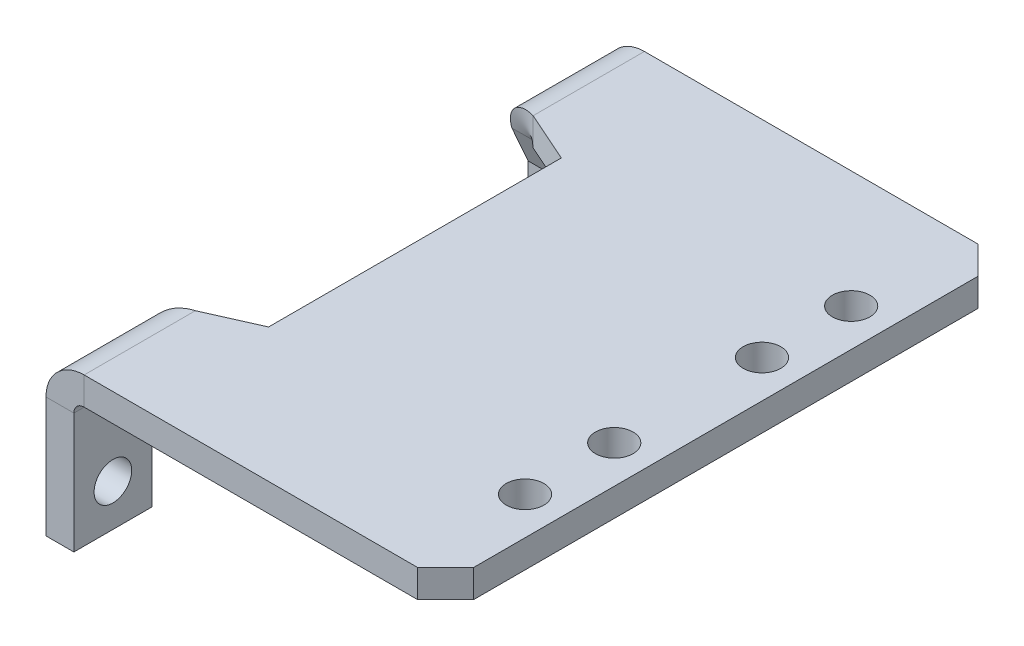
ISO-10303-21;
HEADER;
FILE_DESCRIPTION(('STEP AP214'),'2;1');
FILE_NAME('part.step','',(''),(''),'','','');
FILE_SCHEMA(('AUTOMOTIVE_DESIGN { 1 0 10303 214 1 1 1 1 }'));
ENDSEC;
DATA;
#1=APPLICATION_CONTEXT('core data for automotive mechanical design processes');
#2=APPLICATION_PROTOCOL_DEFINITION('international standard','automotive_design',2000,#1);
#3=PRODUCT_CONTEXT('',#1,'mechanical');
#4=PRODUCT('Part','Part','',(#3));
#5=PRODUCT_RELATED_PRODUCT_CATEGORY('part','',(#4));
#6=PRODUCT_DEFINITION_FORMATION('','',#4);
#7=PRODUCT_DEFINITION_CONTEXT('part definition',#1,'design');
#8=PRODUCT_DEFINITION('design','',#6,#7);
#9=PRODUCT_DEFINITION_SHAPE('','',#8);
#10=(LENGTH_UNIT() NAMED_UNIT(*) SI_UNIT(.MILLI.,.METRE.));
#11=(NAMED_UNIT(*) PLANE_ANGLE_UNIT() SI_UNIT($,.RADIAN.));
#12=(NAMED_UNIT(*) SI_UNIT($,.STERADIAN.) SOLID_ANGLE_UNIT());
#13=UNCERTAINTY_MEASURE_WITH_UNIT(LENGTH_MEASURE(1.E-05),#10,'distance_accuracy_value','');
#14=(GEOMETRIC_REPRESENTATION_CONTEXT(3) GLOBAL_UNCERTAINTY_ASSIGNED_CONTEXT((#13)) GLOBAL_UNIT_ASSIGNED_CONTEXT((#10,
#11,#12)) REPRESENTATION_CONTEXT('',''));
#15=CARTESIAN_POINT('',(0.,0.,0.));
#16=DIRECTION('',(0.,0.,1.));
#17=DIRECTION('',(1.,0.,0.));
#18=AXIS2_PLACEMENT_3D('',#15,#16,#17);
#19=CARTESIAN_POINT('',(-2.,-12.65,-14.5));
#20=DIRECTION('',(0.,-0.406138466053448,0.913811548620257));
#21=DIRECTION('',(0.,-0.913811548620257,-0.406138466053448));
#22=AXIS2_PLACEMENT_3D('',#19,#20,#21);
#23=PLANE('',#22);
#24=DIRECTION('',(0.,-0.913811548620257,-0.406138466053448));
#25=VECTOR('',#24,1.);
#26=CARTESIAN_POINT('',(0.,-12.65,-14.5));
#27=LINE('',#26,#25);
#28=CARTESIAN_POINT('',(0.,-10.013922450556,-13.3284099780249));
#29=VERTEX_POINT('',#28);
#30=CARTESIAN_POINT('',(0.,-12.65,-14.5));
#31=VERTEX_POINT('',#30);
#32=EDGE_CURVE('E531',#29,#31,#27,.T.);
#33=ORIENTED_EDGE('',*,*,#32,.F.);
#34=CARTESIAN_POINT('',(-2.,-10.013922450556,-13.3284099780249));
#35=CARTESIAN_POINT('',(0.,-10.013922450556,-13.3284099780249));
#36=B_SPLINE_CURVE_WITH_KNOTS('',1,(#34,#35),.UNSPECIFIED.,.F.,.F.,(2,2),(0.,1.),.UNSPECIFIED.);
#37=CARTESIAN_POINT('',(-2.,-10.013922450556,-13.3284099780249));
#38=VERTEX_POINT('',#37);
#39=EDGE_CURVE('E307',#29,#38,#36,.F.);
#40=ORIENTED_EDGE('',*,*,#39,.T.);
#41=DIRECTION('',(0.,-0.913811548620257,-0.406138466053448));
#42=VECTOR('',#41,1.);
#43=CARTESIAN_POINT('',(-2.,-12.65,-14.5));
#44=LINE('',#43,#42);
#45=CARTESIAN_POINT('',(-2.,-12.65,-14.5));
#46=VERTEX_POINT('',#45);
#47=EDGE_CURVE('E637',#38,#46,#44,.T.);
#48=ORIENTED_EDGE('',*,*,#47,.T.);
#49=DIRECTION('',(1.,0.,0.));
#50=VECTOR('',#49,1.);
#51=CARTESIAN_POINT('',(-2.,-12.65,-14.5));
#52=LINE('',#51,#50);
#53=EDGE_CURVE('E630',#46,#31,#52,.T.);
#54=ORIENTED_EDGE('',*,*,#53,.T.);
#55=EDGE_LOOP('',(#33,#40,#48,#54));
#56=FACE_BOUND('',#55,.T.);
#57=ADVANCED_FACE('F56',(#56),#23,.T.);
#58=CARTESIAN_POINT('',(-2.,18.65,-20.1));
#59=DIRECTION('',(0.,0.,-1.));
#60=DIRECTION('',(0.,1.,0.));
#61=AXIS2_PLACEMENT_3D('',#58,#59,#60);
#62=PLANE('',#61);
#63=DIRECTION('',(0.,1.,0.));
#64=VECTOR('',#63,1.);
#65=CARTESIAN_POINT('',(-2.,18.65,-20.1));
#66=LINE('',#65,#64);
#67=CARTESIAN_POINT('',(-2.,-18.65,-20.1));
#68=VERTEX_POINT('',#67);
#69=CARTESIAN_POINT('',(-2.,-10.013922450556,-20.1));
#70=VERTEX_POINT('',#69);
#71=EDGE_CURVE('E639',#68,#70,#66,.T.);
#72=ORIENTED_EDGE('',*,*,#71,.T.);
#73=DIRECTION('',(1.,0.,0.));
#74=VECTOR('',#73,1.);
#75=CARTESIAN_POINT('',(-2.,-10.013922450556,-20.1));
#76=LINE('',#75,#74);
#77=CARTESIAN_POINT('',(0.,-10.013922450556,-20.1));
#78=VERTEX_POINT('',#77);
#79=EDGE_CURVE('E544',#70,#78,#76,.T.);
#80=ORIENTED_EDGE('',*,*,#79,.T.);
#81=DIRECTION('',(0.,1.,0.));
#82=VECTOR('',#81,1.);
#83=CARTESIAN_POINT('',(0.,18.65,-20.1));
#84=LINE('',#83,#82);
#85=CARTESIAN_POINT('',(0.,-18.65,-20.1));
#86=VERTEX_POINT('',#85);
#87=EDGE_CURVE('E539',#86,#78,#84,.T.);
#88=ORIENTED_EDGE('',*,*,#87,.F.);
#89=DIRECTION('',(1.,0.,0.));
#90=VECTOR('',#89,1.);
#91=CARTESIAN_POINT('',(-2.,-18.65,-20.1));
#92=LINE('',#91,#90);
#93=EDGE_CURVE('E644',#68,#86,#92,.T.);
#94=ORIENTED_EDGE('',*,*,#93,.F.);
#95=EDGE_LOOP('',(#72,#80,#88,#94));
#96=FACE_BOUND('',#95,.T.);
#97=ADVANCED_FACE('F518',(#96),#62,.T.);
#98=CARTESIAN_POINT('',(-2.,0.,0.));
#99=DIRECTION('',(-1.,0.,0.));
#100=DIRECTION('',(0.,0.,1.));
#101=AXIS2_PLACEMENT_3D('',#98,#99,#100);
#102=PLANE('',#101);
#103=CARTESIAN_POINT('',(-2.,-15.65,-17.3));
#104=DIRECTION('',(1.,0.,0.));
#105=DIRECTION('',(0.,0.,1.));
#106=AXIS2_PLACEMENT_3D('',#103,#104,#105);
#107=CIRCLE('',#106,1.35);
#108=CARTESIAN_POINT('',(-2.,-15.65,-15.95));
#109=VERTEX_POINT('',#108);
#110=EDGE_CURVE('E659',#109,#109,#107,.T.);
#111=ORIENTED_EDGE('',*,*,#110,.T.);
#112=EDGE_LOOP('',(#111));
#113=FACE_BOUND('',#112,.T.);
#114=ORIENTED_EDGE('',*,*,#47,.F.);
#115=DIRECTION('',(0.,0.,-1.));
#116=VECTOR('',#115,1.);
#117=CARTESIAN_POINT('',(-2.,-10.013922450556,0.));
#118=LINE('',#117,#116);
#119=EDGE_CURVE('E623',#38,#70,#118,.T.);
#120=ORIENTED_EDGE('',*,*,#119,.T.);
#121=ORIENTED_EDGE('',*,*,#71,.F.);
#122=DIRECTION('',(0.,0.,-1.));
#123=VECTOR('',#122,1.);
#124=CARTESIAN_POINT('',(-2.,-18.65,-14.5));
#125=LINE('',#124,#123);
#126=CARTESIAN_POINT('',(-2.,-18.65,-14.5));
#127=VERTEX_POINT('',#126);
#128=EDGE_CURVE('E646',#127,#68,#125,.T.);
#129=ORIENTED_EDGE('',*,*,#128,.F.);
#130=DIRECTION('',(0.,-1.,0.));
#131=VECTOR('',#130,1.);
#132=CARTESIAN_POINT('',(-2.,-12.65,-14.5));
#133=LINE('',#132,#131);
#134=EDGE_CURVE('E638',#46,#127,#133,.T.);
#135=ORIENTED_EDGE('',*,*,#134,.F.);
#136=EDGE_LOOP('',(#114,#120,#121,#129,#135));
#137=FACE_BOUND('',#136,.T.);
#138=ADVANCED_FACE('F514',(#113,#137),#102,.T.);
#139=CARTESIAN_POINT('',(-2.,-18.65,-14.5));
#140=DIRECTION('',(0.,-1.,0.));
#141=DIRECTION('',(0.,0.,-1.));
#142=AXIS2_PLACEMENT_3D('',#139,#140,#141);
#143=PLANE('',#142);
#144=DIRECTION('',(0.,0.,-1.));
#145=VECTOR('',#144,1.);
#146=CARTESIAN_POINT('',(0.,-18.65,-14.5));
#147=LINE('',#146,#145);
#148=CARTESIAN_POINT('',(0.,-18.65,-14.5));
#149=VERTEX_POINT('',#148);
#150=EDGE_CURVE('E657',#149,#86,#147,.T.);
#151=ORIENTED_EDGE('',*,*,#150,.F.);
#152=DIRECTION('',(1.,0.,0.));
#153=VECTOR('',#152,1.);
#154=CARTESIAN_POINT('',(-2.,-18.65,-14.5));
#155=LINE('',#154,#153);
#156=EDGE_CURVE('E628',#127,#149,#155,.T.);
#157=ORIENTED_EDGE('',*,*,#156,.F.);
#158=ORIENTED_EDGE('',*,*,#128,.T.);
#159=ORIENTED_EDGE('',*,*,#93,.T.);
#160=EDGE_LOOP('',(#151,#157,#158,#159));
#161=FACE_BOUND('',#160,.T.);
#162=ADVANCED_FACE('F510',(#161),#143,.T.);
#163=CARTESIAN_POINT('',(-2.,-12.65,-14.5));
#164=DIRECTION('',(0.,0.,1.));
#165=DIRECTION('',(0.,-1.,0.));
#166=AXIS2_PLACEMENT_3D('',#163,#164,#165);
#167=PLANE('',#166);
#168=DIRECTION('',(0.,-1.,0.));
#169=VECTOR('',#168,1.);
#170=CARTESIAN_POINT('',(0.,-12.65,-14.5));
#171=LINE('',#170,#169);
#172=EDGE_CURVE('E538',#31,#149,#171,.T.);
#173=ORIENTED_EDGE('',*,*,#172,.F.);
#174=ORIENTED_EDGE('',*,*,#53,.F.);
#175=ORIENTED_EDGE('',*,*,#134,.T.);
#176=ORIENTED_EDGE('',*,*,#156,.T.);
#177=EDGE_LOOP('',(#173,#174,#175,#176));
#178=FACE_BOUND('',#177,.T.);
#179=ADVANCED_FACE('F507',(#178),#167,.T.);
#180=CARTESIAN_POINT('',(0.,0.,0.));
#181=DIRECTION('',(-1.,0.,0.));
#182=DIRECTION('',(0.,0.,1.));
#183=AXIS2_PLACEMENT_3D('',#180,#181,#182);
#184=PLANE('',#183);
#185=DIRECTION('',(0.,0.,-1.));
#186=VECTOR('',#185,1.);
#187=CARTESIAN_POINT('',(0.,-10.013922450556,0.));
#188=LINE('',#187,#186);
#189=EDGE_CURVE('E542',#29,#78,#188,.T.);
#190=ORIENTED_EDGE('',*,*,#189,.F.);
#191=ORIENTED_EDGE('',*,*,#32,.T.);
#192=ORIENTED_EDGE('',*,*,#172,.T.);
#193=ORIENTED_EDGE('',*,*,#150,.T.);
#194=ORIENTED_EDGE('',*,*,#87,.T.);
#195=EDGE_LOOP('',(#190,#191,#192,#193,#194));
#196=FACE_BOUND('',#195,.T.);
#197=CARTESIAN_POINT('',(0.,-15.65,-17.3));
#198=DIRECTION('',(1.,0.,0.));
#199=DIRECTION('',(0.,0.,1.));
#200=AXIS2_PLACEMENT_3D('',#197,#198,#199);
#201=CIRCLE('',#200,1.35);
#202=CARTESIAN_POINT('',(0.,-15.65,-15.95));
#203=VERTEX_POINT('',#202);
#204=EDGE_CURVE('E413',#203,#203,#201,.T.);
#205=ORIENTED_EDGE('',*,*,#204,.F.);
#206=EDGE_LOOP('',(#205));
#207=FACE_BOUND('',#206,.T.);
#208=ADVANCED_FACE('F505',(#196,#207),#184,.F.);
#209=CARTESIAN_POINT('',(-2.,-15.65,-17.3));
#210=DIRECTION('',(1.,0.,0.));
#211=DIRECTION('',(0.,0.,-1.));
#212=AXIS2_PLACEMENT_3D('',#209,#210,#211);
#213=CYLINDRICAL_SURFACE('',#212,1.35);
#214=ORIENTED_EDGE('',*,*,#110,.F.);
#215=EDGE_LOOP('',(#214));
#216=FACE_BOUND('',#215,.T.);
#217=ORIENTED_EDGE('',*,*,#204,.T.);
#218=EDGE_LOOP('',(#217));
#219=FACE_BOUND('',#218,.T.);
#220=ADVANCED_FACE('F502',(#216,#219),#213,.F.);
#221=CARTESIAN_POINT('',(23.972677549444,-7.27732245055609,11.7));
#222=DIRECTION('',(0.,-1.,0.));
#223=DIRECTION('',(0.,0.,-1.));
#224=AXIS2_PLACEMENT_3D('',#221,#222,#223);
#225=CYLINDRICAL_SURFACE('',#224,1.35);
#226=CARTESIAN_POINT('',(23.972677549444,-7.27732245055609,11.7));
#227=DIRECTION('',(0.,-1.,0.));
#228=DIRECTION('',(0.,0.,-1.));
#229=AXIS2_PLACEMENT_3D('',#226,#227,#228);
#230=CIRCLE('',#229,1.35);
#231=CARTESIAN_POINT('',(23.972677549444,-7.27732245055609,10.35));
#232=VERTEX_POINT('',#231);
#233=EDGE_CURVE('E436',#232,#232,#230,.T.);
#234=ORIENTED_EDGE('',*,*,#233,.F.);
#235=EDGE_LOOP('',(#234));
#236=FACE_BOUND('',#235,.T.);
#237=CARTESIAN_POINT('',(23.972677549444,-9.27732245055609,11.7));
#238=DIRECTION('',(0.,-1.,0.));
#239=DIRECTION('',(0.,0.,-1.));
#240=AXIS2_PLACEMENT_3D('',#237,#238,#239);
#241=CIRCLE('',#240,1.35);
#242=CARTESIAN_POINT('',(23.972677549444,-9.27732245055609,10.35));
#243=VERTEX_POINT('',#242);
#244=EDGE_CURVE('E464',#243,#243,#241,.T.);
#245=ORIENTED_EDGE('',*,*,#244,.T.);
#246=EDGE_LOOP('',(#245));
#247=FACE_BOUND('',#246,.T.);
#248=ADVANCED_FACE('F377',(#236,#247),#225,.F.);
#249=CARTESIAN_POINT('',(23.972677549444,-7.27732245055609,-5.30000000000001));
#250=DIRECTION('',(0.,-1.,0.));
#251=DIRECTION('',(0.,0.,-1.));
#252=AXIS2_PLACEMENT_3D('',#249,#250,#251);
#253=CYLINDRICAL_SURFACE('',#252,1.35);
#254=CARTESIAN_POINT('',(23.972677549444,-7.27732245055609,-5.30000000000001));
#255=DIRECTION('',(0.,-1.,0.));
#256=DIRECTION('',(0.,0.,-1.));
#257=AXIS2_PLACEMENT_3D('',#254,#255,#256);
#258=CIRCLE('',#257,1.35);
#259=CARTESIAN_POINT('',(23.972677549444,-7.27732245055609,-6.65000000000001));
#260=VERTEX_POINT('',#259);
#261=EDGE_CURVE('E439',#260,#260,#258,.T.);
#262=ORIENTED_EDGE('',*,*,#261,.F.);
#263=EDGE_LOOP('',(#262));
#264=FACE_BOUND('',#263,.T.);
#265=CARTESIAN_POINT('',(23.972677549444,-9.27732245055609,-5.30000000000001));
#266=DIRECTION('',(0.,-1.,0.));
#267=DIRECTION('',(0.,0.,-1.));
#268=AXIS2_PLACEMENT_3D('',#265,#266,#267);
#269=CIRCLE('',#268,1.35);
#270=CARTESIAN_POINT('',(23.972677549444,-9.27732245055609,-6.65000000000001));
#271=VERTEX_POINT('',#270);
#272=EDGE_CURVE('E461',#271,#271,#269,.T.);
#273=ORIENTED_EDGE('',*,*,#272,.T.);
#274=EDGE_LOOP('',(#273));
#275=FACE_BOUND('',#274,.T.);
#276=ADVANCED_FACE('F726',(#264,#275),#253,.F.);
#277=CARTESIAN_POINT('',(23.972677549444,-7.27732245055609,5.3));
#278=DIRECTION('',(0.,-1.,0.));
#279=DIRECTION('',(0.,0.,-1.));
#280=AXIS2_PLACEMENT_3D('',#277,#278,#279);
#281=CYLINDRICAL_SURFACE('',#280,1.35);
#282=CARTESIAN_POINT('',(23.972677549444,-7.27732245055609,5.3));
#283=DIRECTION('',(0.,-1.,0.));
#284=DIRECTION('',(0.,0.,1.));
#285=AXIS2_PLACEMENT_3D('',#282,#283,#284);
#286=CIRCLE('',#285,1.35);
#287=CARTESIAN_POINT('',(23.972677549444,-7.27732245055609,6.65));
#288=VERTEX_POINT('',#287);
#289=EDGE_CURVE('E442',#288,#288,#286,.T.);
#290=ORIENTED_EDGE('',*,*,#289,.F.);
#291=EDGE_LOOP('',(#290));
#292=FACE_BOUND('',#291,.T.);
#293=CARTESIAN_POINT('',(23.972677549444,-9.27732245055609,5.3));
#294=DIRECTION('',(0.,-1.,0.));
#295=DIRECTION('',(0.,0.,1.));
#296=AXIS2_PLACEMENT_3D('',#293,#294,#295);
#297=CIRCLE('',#296,1.35);
#298=CARTESIAN_POINT('',(23.972677549444,-9.27732245055609,6.65));
#299=VERTEX_POINT('',#298);
#300=EDGE_CURVE('E458',#299,#299,#297,.T.);
#301=ORIENTED_EDGE('',*,*,#300,.T.);
#302=EDGE_LOOP('',(#301));
#303=FACE_BOUND('',#302,.T.);
#304=ADVANCED_FACE('F733',(#292,#303),#281,.F.);
#305=CARTESIAN_POINT('',(23.972677549444,-7.27732245055609,-11.7));
#306=DIRECTION('',(0.,-1.,0.));
#307=DIRECTION('',(0.,0.,-1.));
#308=AXIS2_PLACEMENT_3D('',#305,#306,#307);
#309=CYLINDRICAL_SURFACE('',#308,1.35);
#310=CARTESIAN_POINT('',(23.972677549444,-7.27732245055609,-11.7));
#311=DIRECTION('',(0.,-1.,0.));
#312=DIRECTION('',(0.,0.,1.));
#313=AXIS2_PLACEMENT_3D('',#310,#311,#312);
#314=CIRCLE('',#313,1.35);
#315=CARTESIAN_POINT('',(23.972677549444,-7.27732245055609,-10.35));
#316=VERTEX_POINT('',#315);
#317=EDGE_CURVE('E445',#316,#316,#314,.T.);
#318=ORIENTED_EDGE('',*,*,#317,.F.);
#319=EDGE_LOOP('',(#318));
#320=FACE_BOUND('',#319,.T.);
#321=CARTESIAN_POINT('',(23.972677549444,-9.27732245055609,-11.7));
#322=DIRECTION('',(0.,-1.,0.));
#323=DIRECTION('',(0.,0.,1.));
#324=AXIS2_PLACEMENT_3D('',#321,#322,#323);
#325=CIRCLE('',#324,1.35);
#326=CARTESIAN_POINT('',(23.972677549444,-9.27732245055609,-10.35));
#327=VERTEX_POINT('',#326);
#328=EDGE_CURVE('E455',#327,#327,#325,.T.);
#329=ORIENTED_EDGE('',*,*,#328,.T.);
#330=EDGE_LOOP('',(#329));
#331=FACE_BOUND('',#330,.T.);
#332=ADVANCED_FACE('F740',(#320,#331),#309,.F.);
#333=CARTESIAN_POINT('',(4.372677549444,-7.27732245055603,10.5));
#334=DIRECTION('',(-1.,0.,0.));
#335=DIRECTION('',(0.,0.,-1.));
#336=AXIS2_PLACEMENT_3D('',#333,#334,#335);
#337=PLANE('',#336);
#338=DIRECTION('',(0.,0.,-1.));
#339=VECTOR('',#338,1.);
#340=CARTESIAN_POINT('',(4.37267754944399,-9.27732245055603,10.5));
#341=LINE('',#340,#339);
#342=CARTESIAN_POINT('',(4.37267754944399,-9.27732245055603,10.5));
#343=VERTEX_POINT('',#342);
#344=CARTESIAN_POINT('',(4.37267754944399,-9.27732245055603,-10.5));
#345=VERTEX_POINT('',#344);
#346=EDGE_CURVE('E427',#343,#345,#341,.T.);
#347=ORIENTED_EDGE('',*,*,#346,.F.);
#348=DIRECTION('',(0.,-1.,0.));
#349=VECTOR('',#348,1.);
#350=CARTESIAN_POINT('',(4.372677549444,-7.27732245055603,10.5));
#351=LINE('',#350,#349);
#352=CARTESIAN_POINT('',(4.372677549444,-7.27732245055603,10.5));
#353=VERTEX_POINT('',#352);
#354=EDGE_CURVE('E405',#353,#343,#351,.T.);
#355=ORIENTED_EDGE('',*,*,#354,.F.);
#356=DIRECTION('',(0.,0.,-1.));
#357=VECTOR('',#356,1.);
#358=CARTESIAN_POINT('',(4.372677549444,-7.27732245055603,10.5));
#359=LINE('',#358,#357);
#360=CARTESIAN_POINT('',(4.372677549444,-7.27732245055603,-10.5));
#361=VERTEX_POINT('',#360);
#362=EDGE_CURVE('E452',#353,#361,#359,.T.);
#363=ORIENTED_EDGE('',*,*,#362,.T.);
#364=DIRECTION('',(0.,-1.,0.));
#365=VECTOR('',#364,1.);
#366=CARTESIAN_POINT('',(4.372677549444,-7.27732245055603,-10.5));
#367=LINE('',#366,#365);
#368=EDGE_CURVE('E450',#361,#345,#367,.T.);
#369=ORIENTED_EDGE('',*,*,#368,.T.);
#370=EDGE_LOOP('',(#347,#355,#363,#369));
#371=FACE_BOUND('',#370,.T.);
#372=ADVANCED_FACE('F748',(#371),#337,.T.);
#373=CARTESIAN_POINT('',(26.672677549444,-7.2773224505561,20.1));
#374=DIRECTION('',(1.,0.,0.));
#375=DIRECTION('',(0.,0.,1.));
#376=AXIS2_PLACEMENT_3D('',#373,#374,#375);
#377=PLANE('',#376);
#378=DIRECTION('',(0.,0.,1.));
#379=VECTOR('',#378,1.);
#380=CARTESIAN_POINT('',(26.672677549444,-9.2773224505561,20.1));
#381=LINE('',#380,#379);
#382=CARTESIAN_POINT('',(26.672677549444,-9.2773224505561,-18.1));
#383=VERTEX_POINT('',#382);
#384=CARTESIAN_POINT('',(26.672677549444,-9.2773224505561,18.1));
#385=VERTEX_POINT('',#384);
#386=EDGE_CURVE('E420',#383,#385,#381,.T.);
#387=ORIENTED_EDGE('',*,*,#386,.F.);
#388=DIRECTION('',(0.,1.,0.));
#389=VECTOR('',#388,1.);
#390=CARTESIAN_POINT('',(26.672677549444,-7.2773224505561,-18.1));
#391=LINE('',#390,#389);
#392=CARTESIAN_POINT('',(26.672677549444,-7.2773224505561,-18.1));
#393=VERTEX_POINT('',#392);
#394=EDGE_CURVE('E557',#383,#393,#391,.T.);
#395=ORIENTED_EDGE('',*,*,#394,.T.);
#396=DIRECTION('',(0.,0.,1.));
#397=VECTOR('',#396,1.);
#398=CARTESIAN_POINT('',(26.672677549444,-7.2773224505561,20.1));
#399=LINE('',#398,#397);
#400=CARTESIAN_POINT('',(26.672677549444,-7.2773224505561,18.1));
#401=VERTEX_POINT('',#400);
#402=EDGE_CURVE('E448',#393,#401,#399,.T.);
#403=ORIENTED_EDGE('',*,*,#402,.T.);
#404=DIRECTION('',(0.,-1.,0.));
#405=VECTOR('',#404,1.);
#406=CARTESIAN_POINT('',(26.672677549444,-7.2773224505561,18.1));
#407=LINE('',#406,#405);
#408=EDGE_CURVE('E554',#401,#385,#407,.T.);
#409=ORIENTED_EDGE('',*,*,#408,.T.);
#410=EDGE_LOOP('',(#387,#395,#403,#409));
#411=FACE_BOUND('',#410,.T.);
#412=ADVANCED_FACE('F576',(#411),#377,.T.);
#413=CARTESIAN_POINT('',(8.022677549444,-7.27732245055604,0.));
#414=DIRECTION('',(0.,1.,0.));
#415=DIRECTION('',(0.,0.,1.));
#416=AXIS2_PLACEMENT_3D('',#413,#414,#415);
#417=PLANE('',#416);
#418=ORIENTED_EDGE('',*,*,#402,.F.);
#419=DIRECTION('',(0.707106781186546,0.,0.707106781186549));
#420=VECTOR('',#419,1.);
#421=CARTESIAN_POINT('',(26.397677549444,-7.2773224505561,-18.375));
#422=LINE('',#421,#420);
#423=CARTESIAN_POINT('',(24.672677549444,-7.2773224505561,-20.1));
#424=VERTEX_POINT('',#423);
#425=EDGE_CURVE('E64',#393,#424,#422,.F.);
#426=ORIENTED_EDGE('',*,*,#425,.T.);
#427=DIRECTION('',(1.,0.,0.));
#428=VECTOR('',#427,1.);
#429=CARTESIAN_POINT('',(26.672677549444,-7.2773224505561,-20.1));
#430=LINE('',#429,#428);
#431=CARTESIAN_POINT('',(0.736600000000009,-7.27732245055601,-20.1));
#432=VERTEX_POINT('',#431);
#433=EDGE_CURVE('E417',#432,#424,#430,.T.);
#434=ORIENTED_EDGE('',*,*,#433,.F.);
#435=DIRECTION('',(0.,0.,-1.));
#436=VECTOR('',#435,1.);
#437=CARTESIAN_POINT('',(0.73660000000001,-7.27732245055601,0.));
#438=LINE('',#437,#436);
#439=CARTESIAN_POINT('',(0.73660000000001,-7.27732245055601,-12.1160344664196));
#440=VERTEX_POINT('',#439);
#441=EDGE_CURVE('E470',#440,#432,#438,.T.);
#442=ORIENTED_EDGE('',*,*,#441,.F.);
#443=DIRECTION('',(-0.913811548620257,0.,-0.406138466053448));
#444=VECTOR('',#443,1.);
#445=CARTESIAN_POINT('',(-4.627322450556,-7.27732245055599,-14.5));
#446=LINE('',#445,#444);
#447=EDGE_CURVE('E435',#361,#440,#446,.T.);
#448=ORIENTED_EDGE('',*,*,#447,.F.);
#449=ORIENTED_EDGE('',*,*,#362,.F.);
#450=DIRECTION('',(0.913811548620257,0.,-0.406138466053448));
#451=VECTOR('',#450,1.);
#452=CARTESIAN_POINT('',(-4.627322450556,-7.27732245055599,14.5));
#453=LINE('',#452,#451);
#454=CARTESIAN_POINT('',(0.736600000000009,-7.27732245055601,12.1160344664195));
#455=VERTEX_POINT('',#454);
#456=EDGE_CURVE('E414',#455,#353,#453,.T.);
#457=ORIENTED_EDGE('',*,*,#456,.F.);
#458=DIRECTION('',(0.,0.,-1.));
#459=VECTOR('',#458,1.);
#460=CARTESIAN_POINT('',(0.73660000000001,-7.27732245055601,0.));
#461=LINE('',#460,#459);
#462=CARTESIAN_POINT('',(0.736600000000007,-7.27732245055601,20.1));
#463=VERTEX_POINT('',#462);
#464=EDGE_CURVE('E488',#463,#455,#461,.T.);
#465=ORIENTED_EDGE('',*,*,#464,.F.);
#466=DIRECTION('',(-1.,0.,0.));
#467=VECTOR('',#466,1.);
#468=CARTESIAN_POINT('',(26.672677549444,-7.2773224505561,20.1));
#469=LINE('',#468,#467);
#470=CARTESIAN_POINT('',(24.672677549444,-7.2773224505561,20.1));
#471=VERTEX_POINT('',#470);
#472=EDGE_CURVE('E415',#471,#463,#469,.T.);
#473=ORIENTED_EDGE('',*,*,#472,.F.);
#474=DIRECTION('',(-0.707106781186549,0.,0.707106781186546));
#475=VECTOR('',#474,1.);
#476=CARTESIAN_POINT('',(26.397677549444,-7.2773224505561,18.375));
#477=LINE('',#476,#475);
#478=EDGE_CURVE('E76',#471,#401,#477,.F.);
#479=ORIENTED_EDGE('',*,*,#478,.T.);
#480=EDGE_LOOP('',(#418,#426,#434,#442,#448,#449,#457,#465,#473,#479));
#481=FACE_BOUND('',#480,.T.);
#482=ORIENTED_EDGE('',*,*,#317,.T.);
#483=EDGE_LOOP('',(#482));
#484=FACE_BOUND('',#483,.T.);
#485=ORIENTED_EDGE('',*,*,#289,.T.);
#486=EDGE_LOOP('',(#485));
#487=FACE_BOUND('',#486,.T.);
#488=ORIENTED_EDGE('',*,*,#261,.T.);
#489=EDGE_LOOP('',(#488));
#490=FACE_BOUND('',#489,.T.);
#491=ORIENTED_EDGE('',*,*,#233,.T.);
#492=EDGE_LOOP('',(#491));
#493=FACE_BOUND('',#492,.T.);
#494=ADVANCED_FACE('F560',(#481,#484,#487,#490,#493),#417,.T.);
#495=CARTESIAN_POINT('',(-4.627322450556,-7.27732245055599,-14.5));
#496=DIRECTION('',(-0.406138466053448,0.,0.913811548620257));
#497=DIRECTION('',(-0.913811548620257,0.,-0.406138466053448));
#498=AXIS2_PLACEMENT_3D('',#495,#496,#497);
#499=PLANE('',#498);
#500=CARTESIAN_POINT('',(0.736600000000003,-9.27732245055601,-12.1160344664196));
#501=CARTESIAN_POINT('',(0.73660000000001,-7.27732245055601,-12.1160344664196));
#502=B_SPLINE_CURVE_WITH_KNOTS('',1,(#500,#501),.UNSPECIFIED.,.F.,.F.,(2,2),(0.,1.),.UNSPECIFIED.);
#503=CARTESIAN_POINT('',(0.736600000000004,-9.27732245055601,-12.1160344664195));
#504=VERTEX_POINT('',#503);
#505=EDGE_CURVE('E296',#504,#440,#502,.T.);
#506=ORIENTED_EDGE('',*,*,#505,.F.);
#507=DIRECTION('',(-0.913811548620257,0.,-0.406138466053448));
#508=VECTOR('',#507,1.);
#509=CARTESIAN_POINT('',(-4.62732245055601,-9.27732245055599,-14.5));
#510=LINE('',#509,#508);
#511=EDGE_CURVE('E430',#345,#504,#510,.T.);
#512=ORIENTED_EDGE('',*,*,#511,.F.);
#513=ORIENTED_EDGE('',*,*,#368,.F.);
#514=ORIENTED_EDGE('',*,*,#447,.T.);
#515=EDGE_LOOP('',(#506,#512,#513,#514));
#516=FACE_BOUND('',#515,.T.);
#517=ADVANCED_FACE('F770',(#516),#499,.T.);
#518=CARTESIAN_POINT('',(8.02267754944399,-9.27732245055604,0.));
#519=DIRECTION('',(0.,1.,0.));
#520=DIRECTION('',(0.,0.,1.));
#521=AXIS2_PLACEMENT_3D('',#518,#519,#520);
#522=PLANE('',#521);
#523=ORIENTED_EDGE('',*,*,#328,.F.);
#524=EDGE_LOOP('',(#523));
#525=FACE_BOUND('',#524,.T.);
#526=ORIENTED_EDGE('',*,*,#300,.F.);
#527=EDGE_LOOP('',(#526));
#528=FACE_BOUND('',#527,.T.);
#529=ORIENTED_EDGE('',*,*,#272,.F.);
#530=EDGE_LOOP('',(#529));
#531=FACE_BOUND('',#530,.T.);
#532=ORIENTED_EDGE('',*,*,#244,.F.);
#533=EDGE_LOOP('',(#532));
#534=FACE_BOUND('',#533,.T.);
#535=DIRECTION('',(1.,0.,0.));
#536=VECTOR('',#535,1.);
#537=CARTESIAN_POINT('',(26.672677549444,-9.2773224505561,-20.1));
#538=LINE('',#537,#536);
#539=CARTESIAN_POINT('',(0.736600000000002,-9.27732245055601,-20.1));
#540=VERTEX_POINT('',#539);
#541=CARTESIAN_POINT('',(24.672677549444,-9.2773224505561,-20.1));
#542=VERTEX_POINT('',#541);
#543=EDGE_CURVE('E423',#540,#542,#538,.T.);
#544=ORIENTED_EDGE('',*,*,#543,.T.);
#545=DIRECTION('',(-0.707106781186546,0.,-0.707106781186549));
#546=VECTOR('',#545,1.);
#547=CARTESIAN_POINT('',(24.672677549444,-9.2773224505561,-20.1));
#548=LINE('',#547,#546);
#549=EDGE_CURVE('E552',#542,#383,#548,.F.);
#550=ORIENTED_EDGE('',*,*,#549,.T.);
#551=ORIENTED_EDGE('',*,*,#386,.T.);
#552=DIRECTION('',(0.707106781186549,0.,-0.707106781186546));
#553=VECTOR('',#552,1.);
#554=CARTESIAN_POINT('',(26.672677549444,-9.2773224505561,18.1));
#555=LINE('',#554,#553);
#556=CARTESIAN_POINT('',(24.672677549444,-9.2773224505561,20.1));
#557=VERTEX_POINT('',#556);
#558=EDGE_CURVE('E550',#385,#557,#555,.F.);
#559=ORIENTED_EDGE('',*,*,#558,.T.);
#560=DIRECTION('',(-1.,0.,0.));
#561=VECTOR('',#560,1.);
#562=CARTESIAN_POINT('',(26.672677549444,-9.2773224505561,20.1));
#563=LINE('',#562,#561);
#564=CARTESIAN_POINT('',(0.736600000000002,-9.27732245055601,20.1));
#565=VERTEX_POINT('',#564);
#566=EDGE_CURVE('E432',#557,#565,#563,.T.);
#567=ORIENTED_EDGE('',*,*,#566,.T.);
#568=DIRECTION('',(0.,0.,-1.));
#569=VECTOR('',#568,1.);
#570=CARTESIAN_POINT('',(0.736600000000003,-9.27732245055601,0.));
#571=LINE('',#570,#569);
#572=CARTESIAN_POINT('',(0.736600000000002,-9.27732245055601,12.1160344664195));
#573=VERTEX_POINT('',#572);
#574=EDGE_CURVE('E434',#565,#573,#571,.T.);
#575=ORIENTED_EDGE('',*,*,#574,.T.);
#576=DIRECTION('',(0.913811548620257,0.,-0.406138466053448));
#577=VECTOR('',#576,1.);
#578=CARTESIAN_POINT('',(-4.62732245055601,-9.27732245055599,14.5));
#579=LINE('',#578,#577);
#580=EDGE_CURVE('E431',#573,#343,#579,.T.);
#581=ORIENTED_EDGE('',*,*,#580,.T.);
#582=ORIENTED_EDGE('',*,*,#346,.T.);
#583=ORIENTED_EDGE('',*,*,#511,.T.);
#584=DIRECTION('',(0.,0.,-1.));
#585=VECTOR('',#584,1.);
#586=CARTESIAN_POINT('',(0.736600000000003,-9.27732245055601,0.));
#587=LINE('',#586,#585);
#588=EDGE_CURVE('E426',#504,#540,#587,.T.);
#589=ORIENTED_EDGE('',*,*,#588,.T.);
#590=EDGE_LOOP('',(#544,#550,#551,#559,#567,#575,#581,#582,#583,#589));
#591=FACE_BOUND('',#590,.T.);
#592=ADVANCED_FACE('F573',(#525,#528,#531,#534,#591),#522,.F.);
#593=CARTESIAN_POINT('',(26.672677549444,-7.2773224505561,-20.1));
#594=DIRECTION('',(0.,0.,-1.));
#595=DIRECTION('',(1.,0.,0.));
#596=AXIS2_PLACEMENT_3D('',#593,#594,#595);
#597=PLANE('',#596);
#598=ORIENTED_EDGE('',*,*,#433,.T.);
#599=DIRECTION('',(0.,-1.,0.));
#600=VECTOR('',#599,1.);
#601=CARTESIAN_POINT('',(24.672677549444,-7.2773224505561,-20.1));
#602=LINE('',#601,#600);
#603=EDGE_CURVE('E547',#424,#542,#602,.T.);
#604=ORIENTED_EDGE('',*,*,#603,.T.);
#605=ORIENTED_EDGE('',*,*,#543,.F.);
#606=DIRECTION('',(0.,-1.,0.));
#607=VECTOR('',#606,1.);
#608=CARTESIAN_POINT('',(0.736600000000009,-7.27732245055601,-20.1));
#609=LINE('',#608,#607);
#610=EDGE_CURVE('E467',#432,#540,#609,.T.);
#611=ORIENTED_EDGE('',*,*,#610,.F.);
#612=EDGE_LOOP('',(#598,#604,#605,#611));
#613=FACE_BOUND('',#612,.T.);
#614=ADVANCED_FACE('F568',(#613),#597,.T.);
#615=CARTESIAN_POINT('',(26.672677549444,-7.2773224505561,20.1));
#616=DIRECTION('',(0.,0.,1.));
#617=DIRECTION('',(-1.,0.,0.));
#618=AXIS2_PLACEMENT_3D('',#615,#616,#617);
#619=PLANE('',#618);
#620=ORIENTED_EDGE('',*,*,#566,.F.);
#621=DIRECTION('',(0.,1.,0.));
#622=VECTOR('',#621,1.);
#623=CARTESIAN_POINT('',(24.672677549444,-7.2773224505561,20.1));
#624=LINE('',#623,#622);
#625=EDGE_CURVE('E12',#557,#471,#624,.T.);
#626=ORIENTED_EDGE('',*,*,#625,.T.);
#627=ORIENTED_EDGE('',*,*,#472,.T.);
#628=DIRECTION('',(0.,1.,0.));
#629=VECTOR('',#628,1.);
#630=CARTESIAN_POINT('',(0.736600000000009,-7.27732245055601,20.1));
#631=LINE('',#630,#629);
#632=EDGE_CURVE('E471',#565,#463,#631,.T.);
#633=ORIENTED_EDGE('',*,*,#632,.F.);
#634=EDGE_LOOP('',(#620,#626,#627,#633));
#635=FACE_BOUND('',#634,.T.);
#636=ADVANCED_FACE('F500',(#635),#619,.T.);
#637=CARTESIAN_POINT('',(-4.627322450556,-7.27732245055599,14.5));
#638=DIRECTION('',(-0.406138466053448,0.,-0.913811548620257));
#639=DIRECTION('',(0.913811548620257,0.,-0.406138466053448));
#640=AXIS2_PLACEMENT_3D('',#637,#638,#639);
#641=PLANE('',#640);
#642=CARTESIAN_POINT('',(0.736600000000008,-7.27732245055601,12.1160344664195));
#643=CARTESIAN_POINT('',(0.736600000000002,-9.27732245055601,12.1160344664195));
#644=B_SPLINE_CURVE_WITH_KNOTS('',1,(#642,#643),.UNSPECIFIED.,.F.,.F.,(2,2),(0.,1.),.UNSPECIFIED.);
#645=EDGE_CURVE('E401',#455,#573,#644,.T.);
#646=ORIENTED_EDGE('',*,*,#645,.F.);
#647=ORIENTED_EDGE('',*,*,#456,.T.);
#648=ORIENTED_EDGE('',*,*,#354,.T.);
#649=ORIENTED_EDGE('',*,*,#580,.F.);
#650=EDGE_LOOP('',(#646,#647,#648,#649));
#651=FACE_BOUND('',#650,.T.);
#652=ADVANCED_FACE('F490',(#651),#641,.T.);
#653=CARTESIAN_POINT('',(0.7366,-10.013922450556,20.1));
#654=DIRECTION('',(0.,0.,1.));
#655=DIRECTION('',(1.,0.,0.));
#656=AXIS2_PLACEMENT_3D('',#653,#654,#655);
#657=PLANE('',#656);
#658=DIRECTION('',(-1.,0.,0.));
#659=VECTOR('',#658,1.);
#660=CARTESIAN_POINT('',(-2.,-10.013922450556,20.1));
#661=LINE('',#660,#659);
#662=CARTESIAN_POINT('',(0.,-10.013922450556,20.1));
#663=VERTEX_POINT('',#662);
#664=CARTESIAN_POINT('',(-2.,-10.013922450556,20.1));
#665=VERTEX_POINT('',#664);
#666=EDGE_CURVE('E199',#663,#665,#661,.T.);
#667=ORIENTED_EDGE('',*,*,#666,.F.);
#668=CARTESIAN_POINT('',(0.7366,-10.013922450556,20.1));
#669=DIRECTION('',(0.,0.,-1.));
#670=DIRECTION('',(-1.,0.,0.));
#671=AXIS2_PLACEMENT_3D('',#668,#669,#670);
#672=CIRCLE('',#671,0.7366);
#673=EDGE_CURVE('E227',#663,#565,#672,.T.);
#674=ORIENTED_EDGE('',*,*,#673,.T.);
#675=ORIENTED_EDGE('',*,*,#632,.T.);
#676=CARTESIAN_POINT('',(0.7366,-10.013922450556,20.1));
#677=DIRECTION('',(0.,0.,-1.));
#678=DIRECTION('',(1.,0.,0.));
#679=AXIS2_PLACEMENT_3D('',#676,#677,#678);
#680=CIRCLE('',#679,2.7366);
#681=EDGE_CURVE('E311',#665,#463,#680,.T.);
#682=ORIENTED_EDGE('',*,*,#681,.F.);
#683=EDGE_LOOP('',(#667,#674,#675,#682));
#684=FACE_BOUND('',#683,.T.);
#685=ADVANCED_FACE('F345',(#684),#657,.T.);
#686=CARTESIAN_POINT('',(0.736600000000008,-7.27732245055601,12.1160344664195));
#687=CARTESIAN_POINT('',(0.378320070506777,-7.27732245055601,12.2170826325231));
#688=CARTESIAN_POINT('',(0.0203007396624003,-7.3485488235855,12.3180970516871));
#689=CARTESIAN_POINT('',(-0.641603701682999,-7.62271862018575,12.5201596369547));
#690=CARTESIAN_POINT('',(-0.945168553883349,-7.82555416964915,12.6211909295884));
#691=CARTESIAN_POINT('',(-1.45176828090686,-8.33215389667265,12.823253514856));
#692=CARTESIAN_POINT('',(-1.65460383037026,-8.635718748873,12.9242848074898));
#693=CARTESIAN_POINT('',(-1.92877362697051,-9.2976231902184,13.1263473927573));
#694=CARTESIAN_POINT('',(-2.,-9.65564252106278,13.2273618119213));
#695=CARTESIAN_POINT('',(-2.,-10.013922450556,13.3284099780249));
#696=CARTESIAN_POINT('',(0.736600000000002,-9.27732245055601,12.1160344664195));
#697=CARTESIAN_POINT('',(0.64017099898828,-9.27732245055601,12.217074441776));
#698=CARTESIAN_POINT('',(0.543796508380956,-9.29649417692213,12.3180970516871));
#699=CARTESIAN_POINT('',(0.365634259058797,-9.37029139689426,12.5201596369547));
#700=CARTESIAN_POINT('',(0.283924886066478,-9.42488785444551,12.6211909295884));
#701=CARTESIAN_POINT('',(0.1475654038895,-9.56124733662249,12.823253514856));
#702=CARTESIAN_POINT('',(0.092968946338254,-9.64295670961481,12.9242848074898));
#703=CARTESIAN_POINT('',(0.0191717263661188,-9.82111895893697,13.1263473927573));
#704=CARTESIAN_POINT('',(0.,-9.91749344954429,13.2273700026685));
#705=CARTESIAN_POINT('',(0.,-10.013922450556,13.3284099780249));
#706=B_SPLINE_SURFACE_WITH_KNOTS('',1,3,((#686,#687,#688,#689,#690,#691,#692,#693,#694,#695),
(#696,#697,#698,#699,#700,#701,#702,#703,#704,#705)),.UNSPECIFIED.,.F.,.F.,.F.,(2,2),(4,2,2,2,
4),(0.,1.),(0.,0.25,0.5,0.75,1.),.UNSPECIFIED.);
#707=CARTESIAN_POINT('',(0.736600000000002,-9.27732245055601,12.1160344664195));
#708=CARTESIAN_POINT('',(0.64017099898828,-9.27732245055601,12.217074441776));
#709=CARTESIAN_POINT('',(0.543796508380956,-9.29649417692213,12.3180970516871));
#710=CARTESIAN_POINT('',(0.365634259058797,-9.37029139689426,12.5201596369547));
#711=CARTESIAN_POINT('',(0.283924886066478,-9.42488785444551,12.6211909295884));
#712=CARTESIAN_POINT('',(0.1475654038895,-9.56124733662249,12.823253514856));
#713=CARTESIAN_POINT('',(0.092968946338254,-9.64295670961481,12.9242848074898));
#714=CARTESIAN_POINT('',(0.0191717263661188,-9.82111895893697,13.1263473927573));
#715=CARTESIAN_POINT('',(0.,-9.91749344954429,13.2273700026685));
#716=CARTESIAN_POINT('',(0.,-10.013922450556,13.3284099780249));
#717=B_SPLINE_CURVE_WITH_KNOTS('',3,(#707,#708,#709,#710,#711,#712,#713,#714,#715,#716),
.UNSPECIFIED.,.F.,.F.,(4,2,2,2,4),(0.,0.25,0.5,0.75,1.),.UNSPECIFIED.);
#718=CARTESIAN_POINT('',(0.,-10.013922450556,13.3284099780249));
#719=VERTEX_POINT('',#718);
#720=EDGE_CURVE('E320',#573,#719,#717,.T.);
#721=CARTESIAN_POINT('',(0.,-10.013922450556,13.3284099780249));
#722=CARTESIAN_POINT('',(-2.,-10.013922450556,13.3284099780249));
#723=B_SPLINE_CURVE_WITH_KNOTS('',1,(#721,#722),.UNSPECIFIED.,.F.,.F.,(2,2),(0.,1.),.UNSPECIFIED.);
#724=CARTESIAN_POINT('',(-2.,-10.013922450556,13.3284099780249));
#725=VERTEX_POINT('',#724);
#726=EDGE_CURVE('E595',#725,#719,#723,.F.);
#727=CARTESIAN_POINT('',(-2.,-10.013922450556,13.3284099780249));
#728=CARTESIAN_POINT('',(-2.,-9.65564252106278,13.2273618119213));
#729=CARTESIAN_POINT('',(-1.92877362697051,-9.2976231902184,13.1263473927573));
#730=CARTESIAN_POINT('',(-1.65460383037026,-8.635718748873,12.9242848074898));
#731=CARTESIAN_POINT('',(-1.45176828090686,-8.33215389667265,12.823253514856));
#732=CARTESIAN_POINT('',(-0.945168553883349,-7.82555416964915,12.6211909295884));
#733=CARTESIAN_POINT('',(-0.641603701682999,-7.62271862018575,12.5201596369547));
#734=CARTESIAN_POINT('',(0.0203007396624003,-7.3485488235855,12.3180970516871));
#735=CARTESIAN_POINT('',(0.378320070506777,-7.27732245055601,12.2170826325231));
#736=CARTESIAN_POINT('',(0.736600000000008,-7.27732245055601,12.1160344664195));
#737=B_SPLINE_CURVE_WITH_KNOTS('',3,(#727,#728,#729,#730,#731,#732,#733,#734,#735,#736),
.UNSPECIFIED.,.F.,.F.,(4,2,2,2,4),(0.,0.25,0.5,0.75,1.),.UNSPECIFIED.);
#738=EDGE_CURVE('E319',#455,#725,#737,.F.);
#739=ORIENTED_EDGE('',*,*,#720,.T.);
#740=ORIENTED_EDGE('',*,*,#726,.F.);
#741=ORIENTED_EDGE('',*,*,#738,.F.);
#742=ORIENTED_EDGE('',*,*,#645,.T.);
#743=EDGE_LOOP('',(#739,#740,#741,#742));
#744=FACE_BOUND('',#743,.T.);
#745=ADVANCED_FACE('F339',(#744),#706,.T.);
#746=CARTESIAN_POINT('',(0.7366,-10.013922450556,25.3851244008121));
#747=DIRECTION('',(0.,0.,-1.));
#748=DIRECTION('',(-1.,0.,0.));
#749=AXIS2_PLACEMENT_3D('',#746,#747,#748);
#750=CYLINDRICAL_SURFACE('',#749,2.7366);
#751=ORIENTED_EDGE('',*,*,#464,.T.);
#752=ORIENTED_EDGE('',*,*,#738,.T.);
#753=DIRECTION('',(0.,0.,-1.));
#754=VECTOR('',#753,1.);
#755=CARTESIAN_POINT('',(-2.,-10.013922450556,0.));
#756=LINE('',#755,#754);
#757=EDGE_CURVE('E599',#665,#725,#756,.T.);
#758=ORIENTED_EDGE('',*,*,#757,.F.);
#759=ORIENTED_EDGE('',*,*,#681,.T.);
#760=EDGE_LOOP('',(#751,#752,#758,#759));
#761=FACE_BOUND('',#760,.T.);
#762=ADVANCED_FACE('F329',(#761),#750,.T.);
#763=CARTESIAN_POINT('',(0.7366,-10.013922450556,25.3851244008121));
#764=DIRECTION('',(0.,0.,-1.));
#765=DIRECTION('',(-1.,0.,0.));
#766=AXIS2_PLACEMENT_3D('',#763,#764,#765);
#767=CYLINDRICAL_SURFACE('',#766,0.7366);
#768=ORIENTED_EDGE('',*,*,#574,.F.);
#769=ORIENTED_EDGE('',*,*,#673,.F.);
#770=DIRECTION('',(0.,0.,-1.));
#771=VECTOR('',#770,1.);
#772=CARTESIAN_POINT('',(0.,-10.013922450556,0.));
#773=LINE('',#772,#771);
#774=EDGE_CURVE('E218',#663,#719,#773,.T.);
#775=ORIENTED_EDGE('',*,*,#774,.T.);
#776=ORIENTED_EDGE('',*,*,#720,.F.);
#777=EDGE_LOOP('',(#768,#769,#775,#776));
#778=FACE_BOUND('',#777,.T.);
#779=ADVANCED_FACE('F338',(#778),#767,.F.);
#780=CARTESIAN_POINT('',(-2.,-10.013922450556,-13.3284099780249));
#781=CARTESIAN_POINT('',(-2.,-9.65564252106279,-13.2273618119213));
#782=CARTESIAN_POINT('',(-1.92877362697051,-9.2976231902184,-13.1263473927573));
#783=CARTESIAN_POINT('',(-1.65460383037026,-8.635718748873,-12.9242848074898));
#784=CARTESIAN_POINT('',(-1.45176828090686,-8.33215389667265,-12.823253514856));
#785=CARTESIAN_POINT('',(-0.945168553883348,-7.82555416964915,-12.6211909295884));
#786=CARTESIAN_POINT('',(-0.641603701682998,-7.62271862018575,-12.5201596369547));
#787=CARTESIAN_POINT('',(0.0203007396624017,-7.3485488235855,-12.3180970516871));
#788=CARTESIAN_POINT('',(0.378320070506781,-7.27732245055601,-12.2170826325231));
#789=CARTESIAN_POINT('',(0.73660000000001,-7.27732245055601,-12.1160344664196));
#790=CARTESIAN_POINT('',(0.,-10.013922450556,-13.3284099780249));
#791=CARTESIAN_POINT('',(0.,-9.91749344954429,-13.2273700026685));
#792=CARTESIAN_POINT('',(0.0191717263661188,-9.82111895893697,-13.1263473927573));
#793=CARTESIAN_POINT('',(0.092968946338254,-9.64295670961481,-12.9242848074898));
#794=CARTESIAN_POINT('',(0.147565403889501,-9.56124733662249,-12.823253514856));
#795=CARTESIAN_POINT('',(0.283924886066479,-9.42488785444551,-12.6211909295884));
#796=CARTESIAN_POINT('',(0.365634259058797,-9.37029139689426,-12.5201596369547));
#797=CARTESIAN_POINT('',(0.543796508380956,-9.29649417692213,-12.3180970516871));
#798=CARTESIAN_POINT('',(0.640170998988278,-9.27732245055601,-12.217074441776));
#799=CARTESIAN_POINT('',(0.736600000000003,-9.27732245055601,-12.1160344664196));
#800=B_SPLINE_SURFACE_WITH_KNOTS('',1,3,((#780,#781,#782,#783,#784,#785,#786,#787,#788,#789),
(#790,#791,#792,#793,#794,#795,#796,#797,#798,#799)),.UNSPECIFIED.,.F.,.F.,.F.,(2,2),(4,2,2,2,
4),(0.,1.),(0.,0.25,0.5,0.75,1.),.UNSPECIFIED.);
#801=CARTESIAN_POINT('',(0.,-10.013922450556,-13.3284099780249));
#802=CARTESIAN_POINT('',(0.,-9.91749344954429,-13.2273700026685));
#803=CARTESIAN_POINT('',(0.0191717263661188,-9.82111895893697,-13.1263473927573));
#804=CARTESIAN_POINT('',(0.092968946338254,-9.64295670961481,-12.9242848074898));
#805=CARTESIAN_POINT('',(0.147565403889501,-9.56124733662249,-12.823253514856));
#806=CARTESIAN_POINT('',(0.283924886066479,-9.42488785444551,-12.6211909295884));
#807=CARTESIAN_POINT('',(0.365634259058797,-9.37029139689426,-12.5201596369547));
#808=CARTESIAN_POINT('',(0.543796508380956,-9.29649417692213,-12.3180970516871));
#809=CARTESIAN_POINT('',(0.640170998988278,-9.27732245055601,-12.217074441776));
#810=CARTESIAN_POINT('',(0.736600000000003,-9.27732245055601,-12.1160344664196));
#811=B_SPLINE_CURVE_WITH_KNOTS('',3,(#801,#802,#803,#804,#805,#806,#807,#808,#809,#810),
.UNSPECIFIED.,.F.,.F.,(4,2,2,2,4),(0.,0.25,0.5,0.75,1.),.UNSPECIFIED.);
#812=EDGE_CURVE('E210',#29,#504,#811,.T.);
#813=CARTESIAN_POINT('',(0.73660000000001,-7.27732245055601,-12.1160344664196));
#814=CARTESIAN_POINT('',(0.378320070506781,-7.27732245055601,-12.2170826325231));
#815=CARTESIAN_POINT('',(0.0203007396624017,-7.3485488235855,-12.3180970516871));
#816=CARTESIAN_POINT('',(-0.641603701682998,-7.62271862018575,-12.5201596369547));
#817=CARTESIAN_POINT('',(-0.945168553883348,-7.82555416964915,-12.6211909295884));
#818=CARTESIAN_POINT('',(-1.45176828090686,-8.33215389667265,-12.823253514856));
#819=CARTESIAN_POINT('',(-1.65460383037026,-8.635718748873,-12.9242848074898));
#820=CARTESIAN_POINT('',(-1.92877362697051,-9.2976231902184,-13.1263473927573));
#821=CARTESIAN_POINT('',(-2.,-9.65564252106279,-13.2273618119213));
#822=CARTESIAN_POINT('',(-2.,-10.013922450556,-13.3284099780249));
#823=B_SPLINE_CURVE_WITH_KNOTS('',3,(#813,#814,#815,#816,#817,#818,#819,#820,#821,#822),
.UNSPECIFIED.,.F.,.F.,(4,2,2,2,4),(0.,0.25,0.5,0.75,1.),.UNSPECIFIED.);
#824=EDGE_CURVE('E228',#38,#440,#823,.F.);
#825=ORIENTED_EDGE('',*,*,#39,.F.);
#826=ORIENTED_EDGE('',*,*,#812,.T.);
#827=ORIENTED_EDGE('',*,*,#505,.T.);
#828=ORIENTED_EDGE('',*,*,#824,.F.);
#829=EDGE_LOOP('',(#825,#826,#827,#828));
#830=FACE_BOUND('',#829,.T.);
#831=ADVANCED_FACE('F256',(#830),#800,.T.);
#832=CARTESIAN_POINT('',(0.7366,-10.013922450556,-20.1));
#833=DIRECTION('',(0.,0.,-1.));
#834=DIRECTION('',(-1.,0.,0.));
#835=AXIS2_PLACEMENT_3D('',#832,#833,#834);
#836=PLANE('',#835);
#837=CARTESIAN_POINT('',(0.7366,-10.013922450556,-20.1));
#838=DIRECTION('',(0.,0.,-1.));
#839=DIRECTION('',(-1.,0.,0.));
#840=AXIS2_PLACEMENT_3D('',#837,#838,#839);
#841=CIRCLE('',#840,0.7366);
#842=EDGE_CURVE('E229',#540,#78,#841,.F.);
#843=ORIENTED_EDGE('',*,*,#842,.T.);
#844=ORIENTED_EDGE('',*,*,#79,.F.);
#845=CARTESIAN_POINT('',(0.7366,-10.013922450556,-20.1));
#846=DIRECTION('',(0.,0.,1.));
#847=DIRECTION('',(-1.,0.,0.));
#848=AXIS2_PLACEMENT_3D('',#845,#846,#847);
#849=CIRCLE('',#848,2.7366);
#850=EDGE_CURVE('E225',#432,#70,#849,.T.);
#851=ORIENTED_EDGE('',*,*,#850,.F.);
#852=ORIENTED_EDGE('',*,*,#610,.T.);
#853=EDGE_LOOP('',(#843,#844,#851,#852));
#854=FACE_BOUND('',#853,.T.);
#855=ADVANCED_FACE('F249',(#854),#836,.T.);
#856=CARTESIAN_POINT('',(0.7366,-10.013922450556,-8.04328557721283));
#857=DIRECTION('',(0.,0.,-1.));
#858=DIRECTION('',(-1.,0.,0.));
#859=AXIS2_PLACEMENT_3D('',#856,#857,#858);
#860=CYLINDRICAL_SURFACE('',#859,2.7366);
#861=ORIENTED_EDGE('',*,*,#441,.T.);
#862=ORIENTED_EDGE('',*,*,#850,.T.);
#863=ORIENTED_EDGE('',*,*,#119,.F.);
#864=ORIENTED_EDGE('',*,*,#824,.T.);
#865=EDGE_LOOP('',(#861,#862,#863,#864));
#866=FACE_BOUND('',#865,.T.);
#867=ADVANCED_FACE('F238',(#866),#860,.T.);
#868=CARTESIAN_POINT('',(0.7366,-10.013922450556,-8.04328557721283));
#869=DIRECTION('',(0.,0.,-1.));
#870=DIRECTION('',(-1.,0.,0.));
#871=AXIS2_PLACEMENT_3D('',#868,#869,#870);
#872=CYLINDRICAL_SURFACE('',#871,0.7366);
#873=ORIENTED_EDGE('',*,*,#588,.F.);
#874=ORIENTED_EDGE('',*,*,#812,.F.);
#875=ORIENTED_EDGE('',*,*,#189,.T.);
#876=ORIENTED_EDGE('',*,*,#842,.F.);
#877=EDGE_LOOP('',(#873,#874,#875,#876));
#878=FACE_BOUND('',#877,.T.);
#879=ADVANCED_FACE('F248',(#878),#872,.F.);
#880=CARTESIAN_POINT('',(-2.,-18.65,20.1));
#881=DIRECTION('',(0.,-1.,0.));
#882=DIRECTION('',(0.,0.,-1.));
#883=AXIS2_PLACEMENT_3D('',#880,#881,#882);
#884=PLANE('',#883);
#885=DIRECTION('',(0.,0.,-1.));
#886=VECTOR('',#885,1.);
#887=CARTESIAN_POINT('',(0.,-18.65,20.1));
#888=LINE('',#887,#886);
#889=CARTESIAN_POINT('',(0.,-18.65,20.1));
#890=VERTEX_POINT('',#889);
#891=CARTESIAN_POINT('',(0.,-18.65,14.5));
#892=VERTEX_POINT('',#891);
#893=EDGE_CURVE('E209',#890,#892,#888,.T.);
#894=ORIENTED_EDGE('',*,*,#893,.F.);
#895=DIRECTION('',(1.,0.,0.));
#896=VECTOR('',#895,1.);
#897=CARTESIAN_POINT('',(-2.,-18.65,20.1));
#898=LINE('',#897,#896);
#899=CARTESIAN_POINT('',(-2.,-18.65,20.1));
#900=VERTEX_POINT('',#899);
#901=EDGE_CURVE('E196',#900,#890,#898,.T.);
#902=ORIENTED_EDGE('',*,*,#901,.F.);
#903=DIRECTION('',(0.,0.,-1.));
#904=VECTOR('',#903,1.);
#905=CARTESIAN_POINT('',(-2.,-18.65,20.1));
#906=LINE('',#905,#904);
#907=CARTESIAN_POINT('',(-2.,-18.65,14.5));
#908=VERTEX_POINT('',#907);
#909=EDGE_CURVE('E207',#900,#908,#906,.T.);
#910=ORIENTED_EDGE('',*,*,#909,.T.);
#911=DIRECTION('',(1.,0.,0.));
#912=VECTOR('',#911,1.);
#913=CARTESIAN_POINT('',(-2.,-18.65,14.5));
#914=LINE('',#913,#912);
#915=EDGE_CURVE('E217',#908,#892,#914,.T.);
#916=ORIENTED_EDGE('',*,*,#915,.T.);
#917=EDGE_LOOP('',(#894,#902,#910,#916));
#918=FACE_BOUND('',#917,.T.);
#919=ADVANCED_FACE('F206',(#918),#884,.T.);
#920=CARTESIAN_POINT('',(-2.,-18.65,14.5));
#921=DIRECTION('',(0.,0.,-1.));
#922=DIRECTION('',(0.,1.,0.));
#923=AXIS2_PLACEMENT_3D('',#920,#921,#922);
#924=PLANE('',#923);
#925=DIRECTION('',(0.,1.,0.));
#926=VECTOR('',#925,1.);
#927=CARTESIAN_POINT('',(0.,-18.65,14.5));
#928=LINE('',#927,#926);
#929=CARTESIAN_POINT('',(0.,-12.65,14.5));
#930=VERTEX_POINT('',#929);
#931=EDGE_CURVE('E587',#892,#930,#928,.T.);
#932=ORIENTED_EDGE('',*,*,#931,.F.);
#933=ORIENTED_EDGE('',*,*,#915,.F.);
#934=DIRECTION('',(0.,1.,0.));
#935=VECTOR('',#934,1.);
#936=CARTESIAN_POINT('',(-2.,-18.65,14.5));
#937=LINE('',#936,#935);
#938=CARTESIAN_POINT('',(-2.,-12.65,14.5));
#939=VERTEX_POINT('',#938);
#940=EDGE_CURVE('E216',#908,#939,#937,.T.);
#941=ORIENTED_EDGE('',*,*,#940,.T.);
#942=DIRECTION('',(1.,0.,0.));
#943=VECTOR('',#942,1.);
#944=CARTESIAN_POINT('',(-2.,-12.65,14.5));
#945=LINE('',#944,#943);
#946=EDGE_CURVE('E603',#939,#930,#945,.T.);
#947=ORIENTED_EDGE('',*,*,#946,.T.);
#948=EDGE_LOOP('',(#932,#933,#941,#947));
#949=FACE_BOUND('',#948,.T.);
#950=ADVANCED_FACE('F606',(#949),#924,.T.);
#951=CARTESIAN_POINT('',(-2.,-15.65,17.3));
#952=DIRECTION('',(1.,0.,0.));
#953=DIRECTION('',(0.,0.,-1.));
#954=AXIS2_PLACEMENT_3D('',#951,#952,#953);
#955=CYLINDRICAL_SURFACE('',#954,1.35);
#956=CARTESIAN_POINT('',(-2.,-15.65,17.3));
#957=DIRECTION('',(1.,0.,0.));
#958=DIRECTION('',(0.,0.,-1.));
#959=AXIS2_PLACEMENT_3D('',#956,#957,#958);
#960=CIRCLE('',#959,1.35);
#961=CARTESIAN_POINT('',(-2.,-15.65,15.95));
#962=VERTEX_POINT('',#961);
#963=EDGE_CURVE('E596',#962,#962,#960,.T.);
#964=ORIENTED_EDGE('',*,*,#963,.F.);
#965=EDGE_LOOP('',(#964));
#966=FACE_BOUND('',#965,.T.);
#967=CARTESIAN_POINT('',(0.,-15.65,17.3));
#968=DIRECTION('',(1.,0.,0.));
#969=DIRECTION('',(0.,0.,-1.));
#970=AXIS2_PLACEMENT_3D('',#967,#968,#969);
#971=CIRCLE('',#970,1.35);
#972=CARTESIAN_POINT('',(0.,-15.65,15.95));
#973=VERTEX_POINT('',#972);
#974=EDGE_CURVE('E600',#973,#973,#971,.T.);
#975=ORIENTED_EDGE('',*,*,#974,.T.);
#976=EDGE_LOOP('',(#975));
#977=FACE_BOUND('',#976,.T.);
#978=ADVANCED_FACE('F846',(#966,#977),#955,.F.);
#979=CARTESIAN_POINT('',(-2.,0.,0.));
#980=DIRECTION('',(-1.,0.,0.));
#981=DIRECTION('',(0.,0.,1.));
#982=AXIS2_PLACEMENT_3D('',#979,#980,#981);
#983=PLANE('',#982);
#984=ORIENTED_EDGE('',*,*,#963,.T.);
#985=EDGE_LOOP('',(#984));
#986=FACE_BOUND('',#985,.T.);
#987=DIRECTION('',(0.,-1.,0.));
#988=VECTOR('',#987,1.);
#989=CARTESIAN_POINT('',(-2.,18.65,20.1));
#990=LINE('',#989,#988);
#991=EDGE_CURVE('E193',#665,#900,#990,.T.);
#992=ORIENTED_EDGE('',*,*,#991,.F.);
#993=ORIENTED_EDGE('',*,*,#757,.T.);
#994=DIRECTION('',(0.,0.913811548620257,-0.406138466053448));
#995=VECTOR('',#994,1.);
#996=CARTESIAN_POINT('',(-2.,-12.65,14.5));
#997=LINE('',#996,#995);
#998=EDGE_CURVE('E616',#939,#725,#997,.T.);
#999=ORIENTED_EDGE('',*,*,#998,.F.);
#1000=ORIENTED_EDGE('',*,*,#940,.F.);
#1001=ORIENTED_EDGE('',*,*,#909,.F.);
#1002=EDGE_LOOP('',(#992,#993,#999,#1000,#1001));
#1003=FACE_BOUND('',#1002,.T.);
#1004=ADVANCED_FACE('F213',(#986,#1003),#983,.T.);
#1005=CARTESIAN_POINT('',(-2.,-12.65,14.5));
#1006=DIRECTION('',(0.,-0.406138466053448,-0.913811548620257));
#1007=DIRECTION('',(0.,0.913811548620257,-0.406138466053448));
#1008=AXIS2_PLACEMENT_3D('',#1005,#1006,#1007);
#1009=PLANE('',#1008);
#1010=ORIENTED_EDGE('',*,*,#998,.T.);
#1011=ORIENTED_EDGE('',*,*,#726,.T.);
#1012=DIRECTION('',(0.,0.913811548620257,-0.406138466053448));
#1013=VECTOR('',#1012,1.);
#1014=CARTESIAN_POINT('',(0.,-12.65,14.5));
#1015=LINE('',#1014,#1013);
#1016=EDGE_CURVE('E585',#930,#719,#1015,.T.);
#1017=ORIENTED_EDGE('',*,*,#1016,.F.);
#1018=ORIENTED_EDGE('',*,*,#946,.F.);
#1019=EDGE_LOOP('',(#1010,#1011,#1017,#1018));
#1020=FACE_BOUND('',#1019,.T.);
#1021=ADVANCED_FACE('F673',(#1020),#1009,.T.);
#1022=CARTESIAN_POINT('',(0.,0.,0.));
#1023=DIRECTION('',(-1.,0.,0.));
#1024=DIRECTION('',(0.,0.,1.));
#1025=AXIS2_PLACEMENT_3D('',#1022,#1023,#1024);
#1026=PLANE('',#1025);
#1027=ORIENTED_EDGE('',*,*,#774,.F.);
#1028=DIRECTION('',(0.,-1.,0.));
#1029=VECTOR('',#1028,1.);
#1030=CARTESIAN_POINT('',(0.,18.65,20.1));
#1031=LINE('',#1030,#1029);
#1032=EDGE_CURVE('E593',#663,#890,#1031,.T.);
#1033=ORIENTED_EDGE('',*,*,#1032,.T.);
#1034=ORIENTED_EDGE('',*,*,#893,.T.);
#1035=ORIENTED_EDGE('',*,*,#931,.T.);
#1036=ORIENTED_EDGE('',*,*,#1016,.T.);
#1037=EDGE_LOOP('',(#1027,#1033,#1034,#1035,#1036));
#1038=FACE_BOUND('',#1037,.T.);
#1039=ORIENTED_EDGE('',*,*,#974,.F.);
#1040=EDGE_LOOP('',(#1039));
#1041=FACE_BOUND('',#1040,.T.);
#1042=ADVANCED_FACE('F610',(#1038,#1041),#1026,.F.);
#1043=CARTESIAN_POINT('',(-2.,18.65,20.1));
#1044=DIRECTION('',(0.,0.,1.));
#1045=DIRECTION('',(0.,-1.,0.));
#1046=AXIS2_PLACEMENT_3D('',#1043,#1044,#1045);
#1047=PLANE('',#1046);
#1048=ORIENTED_EDGE('',*,*,#1032,.F.);
#1049=ORIENTED_EDGE('',*,*,#666,.T.);
#1050=ORIENTED_EDGE('',*,*,#991,.T.);
#1051=ORIENTED_EDGE('',*,*,#901,.T.);
#1052=EDGE_LOOP('',(#1048,#1049,#1050,#1051));
#1053=FACE_BOUND('',#1052,.T.);
#1054=ADVANCED_FACE('F195',(#1053),#1047,.T.);
#1055=CARTESIAN_POINT('',(24.672677549444,-7.2773224505561,-20.1));
#1056=DIRECTION('',(-0.707106781186549,0.,0.707106781186546));
#1057=DIRECTION('',(0.,-1.,0.));
#1058=AXIS2_PLACEMENT_3D('',#1055,#1056,#1057);
#1059=PLANE('',#1058);
#1060=ORIENTED_EDGE('',*,*,#425,.F.);
#1061=ORIENTED_EDGE('',*,*,#394,.F.);
#1062=ORIENTED_EDGE('',*,*,#549,.F.);
#1063=ORIENTED_EDGE('',*,*,#603,.F.);
#1064=EDGE_LOOP('',(#1060,#1061,#1062,#1063));
#1065=FACE_BOUND('',#1064,.T.);
#1066=ADVANCED_FACE('F570',(#1065),#1059,.F.);
#1067=CARTESIAN_POINT('',(26.672677549444,-7.2773224505561,18.1));
#1068=DIRECTION('',(-0.707106781186546,0.,-0.707106781186549));
#1069=DIRECTION('',(0.,-1.,0.));
#1070=AXIS2_PLACEMENT_3D('',#1067,#1068,#1069);
#1071=PLANE('',#1070);
#1072=ORIENTED_EDGE('',*,*,#478,.F.);
#1073=ORIENTED_EDGE('',*,*,#625,.F.);
#1074=ORIENTED_EDGE('',*,*,#558,.F.);
#1075=ORIENTED_EDGE('',*,*,#408,.F.);
#1076=EDGE_LOOP('',(#1072,#1073,#1074,#1075));
#1077=FACE_BOUND('',#1076,.T.);
#1078=ADVANCED_FACE('F58',(#1077),#1071,.F.);
#1079=CLOSED_SHELL('',(#57,#97,#138,#162,#179,#208,#220,#248,#276,#304,#332,#372,#412,#494,#517,
#592,#614,#636,#652,#685,#745,#762,#779,#831,#855,#867,#879,#919,#950,#978,#1004,#1021,#1042,
#1054,#1066,#1078));
#1080=MANIFOLD_SOLID_BREP('B2',#1079);
#1081=ADVANCED_BREP_SHAPE_REPRESENTATION('',(#18,#1080),#14);
#1082=SHAPE_DEFINITION_REPRESENTATION(#9,#1081);
ENDSEC;
END-ISO-10303-21;
